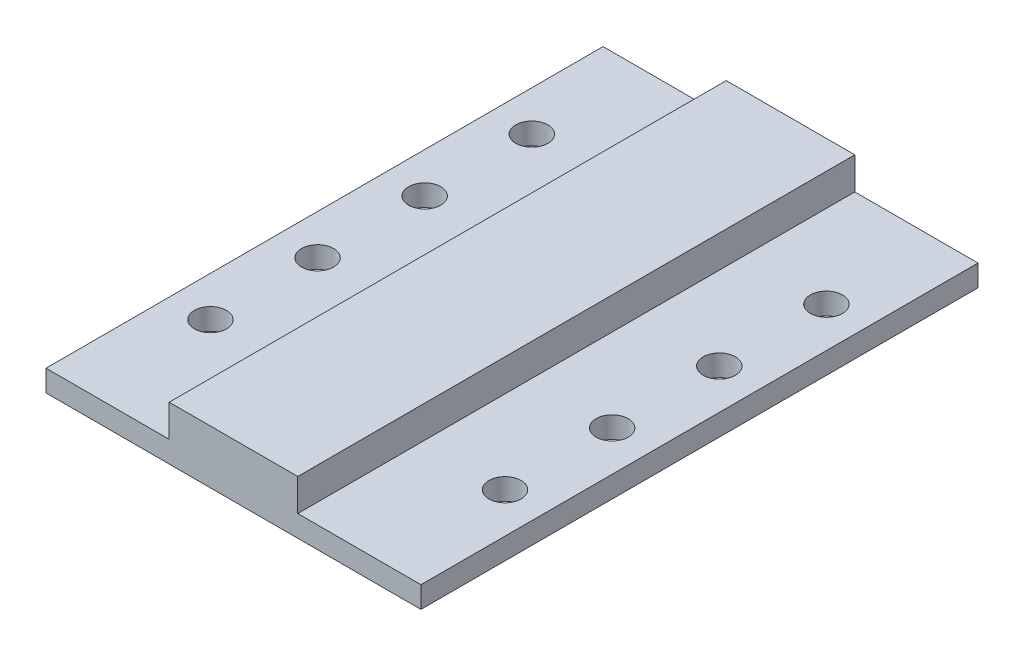
ISO-10303-21;
HEADER;
FILE_DESCRIPTION(('STEP AP214'),'2;1');
FILE_NAME('part.step','',(''),(''),'','','');
FILE_SCHEMA(('AUTOMOTIVE_DESIGN { 1 0 10303 214 1 1 1 1 }'));
ENDSEC;
DATA;
#1=APPLICATION_CONTEXT('core data for automotive mechanical design processes');
#2=APPLICATION_PROTOCOL_DEFINITION('international standard','automotive_design',2000,#1);
#3=PRODUCT_CONTEXT('',#1,'mechanical');
#4=PRODUCT('Part','Part','',(#3));
#5=PRODUCT_RELATED_PRODUCT_CATEGORY('part','',(#4));
#6=PRODUCT_DEFINITION_FORMATION('','',#4);
#7=PRODUCT_DEFINITION_CONTEXT('part definition',#1,'design');
#8=PRODUCT_DEFINITION('design','',#6,#7);
#9=PRODUCT_DEFINITION_SHAPE('','',#8);
#10=(LENGTH_UNIT() NAMED_UNIT(*) SI_UNIT(.MILLI.,.METRE.));
#11=(NAMED_UNIT(*) PLANE_ANGLE_UNIT() SI_UNIT($,.RADIAN.));
#12=(NAMED_UNIT(*) SI_UNIT($,.STERADIAN.) SOLID_ANGLE_UNIT());
#13=UNCERTAINTY_MEASURE_WITH_UNIT(LENGTH_MEASURE(1.E-05),#10,'distance_accuracy_value','');
#14=(GEOMETRIC_REPRESENTATION_CONTEXT(3) GLOBAL_UNCERTAINTY_ASSIGNED_CONTEXT((#13)) GLOBAL_UNIT_ASSIGNED_CONTEXT((#10,
#11,#12)) REPRESENTATION_CONTEXT('',''));
#15=CARTESIAN_POINT('',(0.,0.,0.));
#16=DIRECTION('',(0.,0.,1.));
#17=DIRECTION('',(1.,0.,0.));
#18=AXIS2_PLACEMENT_3D('',#15,#16,#17);
#19=CARTESIAN_POINT('',(0.,2.,0.));
#20=DIRECTION('',(0.,1.,0.));
#21=DIRECTION('',(0.,0.,1.));
#22=AXIS2_PLACEMENT_3D('',#19,#20,#21);
#23=PLANE('',#22);
#24=CARTESIAN_POINT('',(-13.7500000000002,2.,-5.60000000000058));
#25=DIRECTION('',(0.,1.,0.));
#26=DIRECTION('',(0.,0.,1.));
#27=AXIS2_PLACEMENT_3D('',#24,#25,#26);
#28=CIRCLE('',#27,1.50000000000006);
#29=CARTESIAN_POINT('',(-13.7500000000002,2.,-4.10000000000052));
#30=VERTEX_POINT('',#29);
#31=EDGE_CURVE('E433',#30,#30,#28,.T.);
#32=ORIENTED_EDGE('',*,*,#31,.F.);
#33=EDGE_LOOP('',(#32));
#34=FACE_BOUND('',#33,.T.);
#35=CARTESIAN_POINT('',(-13.7500000000003,2.,-15.6000000000006));
#36=DIRECTION('',(0.,1.,0.));
#37=DIRECTION('',(0.,0.,1.));
#38=AXIS2_PLACEMENT_3D('',#35,#36,#37);
#39=CIRCLE('',#38,1.50000000000006);
#40=CARTESIAN_POINT('',(-13.7500000000003,2.,-14.1000000000005));
#41=VERTEX_POINT('',#40);
#42=EDGE_CURVE('E231',#41,#41,#39,.T.);
#43=ORIENTED_EDGE('',*,*,#42,.F.);
#44=EDGE_LOOP('',(#43));
#45=FACE_BOUND('',#44,.T.);
#46=CARTESIAN_POINT('',(-13.75,2.,14.3999999999994));
#47=DIRECTION('',(0.,1.,0.));
#48=DIRECTION('',(0.,0.,1.));
#49=AXIS2_PLACEMENT_3D('',#46,#47,#48);
#50=CIRCLE('',#49,1.50000000000006);
#51=CARTESIAN_POINT('',(-13.75,2.,15.8999999999995));
#52=VERTEX_POINT('',#51);
#53=EDGE_CURVE('E440',#52,#52,#50,.T.);
#54=ORIENTED_EDGE('',*,*,#53,.F.);
#55=EDGE_LOOP('',(#54));
#56=FACE_BOUND('',#55,.T.);
#57=CARTESIAN_POINT('',(-13.7500000000001,2.,4.39999999999942));
#58=DIRECTION('',(0.,1.,0.));
#59=DIRECTION('',(0.,0.,1.));
#60=AXIS2_PLACEMENT_3D('',#57,#58,#59);
#61=CIRCLE('',#60,1.50000000000006);
#62=CARTESIAN_POINT('',(-13.7500000000001,2.,5.89999999999948));
#63=VERTEX_POINT('',#62);
#64=EDGE_CURVE('E436',#63,#63,#61,.T.);
#65=ORIENTED_EDGE('',*,*,#64,.F.);
#66=EDGE_LOOP('',(#65));
#67=FACE_BOUND('',#66,.T.);
#68=DIRECTION('',(1.,0.,0.));
#69=VECTOR('',#68,1.);
#70=CARTESIAN_POINT('',(17.5,2.,26.));
#71=LINE('',#70,#69);
#72=CARTESIAN_POINT('',(-17.5,2.,26.));
#73=VERTEX_POINT('',#72);
#74=CARTESIAN_POINT('',(-6.,2.,26.));
#75=VERTEX_POINT('',#74);
#76=EDGE_CURVE('E138',#73,#75,#71,.T.);
#77=ORIENTED_EDGE('',*,*,#76,.T.);
#78=DIRECTION('',(0.,0.,-1.));
#79=VECTOR('',#78,1.);
#80=CARTESIAN_POINT('',(-6.,2.,38.369316876853));
#81=LINE('',#80,#79);
#82=CARTESIAN_POINT('',(-6.,2.,-26.));
#83=VERTEX_POINT('',#82);
#84=EDGE_CURVE('E119',#75,#83,#81,.T.);
#85=ORIENTED_EDGE('',*,*,#84,.T.);
#86=DIRECTION('',(-1.,0.,0.));
#87=VECTOR('',#86,1.);
#88=CARTESIAN_POINT('',(17.5,2.,-26.));
#89=LINE('',#88,#87);
#90=CARTESIAN_POINT('',(-17.5,2.,-26.));
#91=VERTEX_POINT('',#90);
#92=EDGE_CURVE('E132',#83,#91,#89,.T.);
#93=ORIENTED_EDGE('',*,*,#92,.T.);
#94=DIRECTION('',(0.,0.,1.));
#95=VECTOR('',#94,1.);
#96=CARTESIAN_POINT('',(-17.5,2.,26.));
#97=LINE('',#96,#95);
#98=EDGE_CURVE('E131',#91,#73,#97,.T.);
#99=ORIENTED_EDGE('',*,*,#98,.T.);
#100=EDGE_LOOP('',(#77,#85,#93,#99));
#101=FACE_BOUND('',#100,.T.);
#102=ADVANCED_FACE('F36',(#34,#45,#56,#67,#101),#23,.T.);
#103=CARTESIAN_POINT('',(17.5,2.,26.));
#104=DIRECTION('',(-1.,0.,0.));
#105=DIRECTION('',(0.,0.,1.));
#106=AXIS2_PLACEMENT_3D('',#103,#104,#105);
#107=PLANE('',#106);
#108=DIRECTION('',(0.,0.,-1.));
#109=VECTOR('',#108,1.);
#110=CARTESIAN_POINT('',(17.5,0.,26.));
#111=LINE('',#110,#109);
#112=CARTESIAN_POINT('',(17.5,0.,26.));
#113=VERTEX_POINT('',#112);
#114=CARTESIAN_POINT('',(17.5,0.,-26.));
#115=VERTEX_POINT('',#114);
#116=EDGE_CURVE('E142',#113,#115,#111,.T.);
#117=ORIENTED_EDGE('',*,*,#116,.T.);
#118=DIRECTION('',(0.,-1.,0.));
#119=VECTOR('',#118,1.);
#120=CARTESIAN_POINT('',(17.5,2.,-26.));
#121=LINE('',#120,#119);
#122=CARTESIAN_POINT('',(17.5,2.,-26.));
#123=VERTEX_POINT('',#122);
#124=EDGE_CURVE('E11',#123,#115,#121,.T.);
#125=ORIENTED_EDGE('',*,*,#124,.F.);
#126=DIRECTION('',(0.,0.,-1.));
#127=VECTOR('',#126,1.);
#128=CARTESIAN_POINT('',(17.5,2.,26.));
#129=LINE('',#128,#127);
#130=CARTESIAN_POINT('',(17.5,2.,26.));
#131=VERTEX_POINT('',#130);
#132=EDGE_CURVE('E129',#131,#123,#129,.T.);
#133=ORIENTED_EDGE('',*,*,#132,.F.);
#134=DIRECTION('',(0.,-1.,0.));
#135=VECTOR('',#134,1.);
#136=CARTESIAN_POINT('',(17.5,2.,26.));
#137=LINE('',#136,#135);
#138=EDGE_CURVE('E141',#131,#113,#137,.T.);
#139=ORIENTED_EDGE('',*,*,#138,.T.);
#140=EDGE_LOOP('',(#117,#125,#133,#139));
#141=FACE_BOUND('',#140,.T.);
#142=ADVANCED_FACE('F38',(#141),#107,.F.);
#143=CARTESIAN_POINT('',(17.5,2.,-26.));
#144=DIRECTION('',(0.,0.,1.));
#145=DIRECTION('',(1.,0.,0.));
#146=AXIS2_PLACEMENT_3D('',#143,#144,#145);
#147=PLANE('',#146);
#148=DIRECTION('',(-1.,0.,0.));
#149=VECTOR('',#148,1.);
#150=CARTESIAN_POINT('',(17.5,0.,-26.));
#151=LINE('',#150,#149);
#152=CARTESIAN_POINT('',(-17.5,0.,-26.));
#153=VERTEX_POINT('',#152);
#154=EDGE_CURVE('E145',#115,#153,#151,.T.);
#155=ORIENTED_EDGE('',*,*,#154,.T.);
#156=DIRECTION('',(0.,-1.,0.));
#157=VECTOR('',#156,1.);
#158=CARTESIAN_POINT('',(-17.5,2.,-26.));
#159=LINE('',#158,#157);
#160=EDGE_CURVE('E45',#91,#153,#159,.T.);
#161=ORIENTED_EDGE('',*,*,#160,.F.);
#162=ORIENTED_EDGE('',*,*,#92,.F.);
#163=DIRECTION('',(0.,1.,0.));
#164=VECTOR('',#163,1.);
#165=CARTESIAN_POINT('',(-6.,2.,-26.));
#166=LINE('',#165,#164);
#167=CARTESIAN_POINT('',(-6.,5.,-26.));
#168=VERTEX_POINT('',#167);
#169=EDGE_CURVE('E53',#83,#168,#166,.T.);
#170=ORIENTED_EDGE('',*,*,#169,.T.);
#171=DIRECTION('',(1.,0.,0.));
#172=VECTOR('',#171,1.);
#173=CARTESIAN_POINT('',(-6.,5.,-26.));
#174=LINE('',#173,#172);
#175=CARTESIAN_POINT('',(6.,5.,-26.));
#176=VERTEX_POINT('',#175);
#177=EDGE_CURVE('E125',#168,#176,#174,.T.);
#178=ORIENTED_EDGE('',*,*,#177,.T.);
#179=DIRECTION('',(0.,-1.,0.));
#180=VECTOR('',#179,1.);
#181=CARTESIAN_POINT('',(6.,2.,-26.));
#182=LINE('',#181,#180);
#183=CARTESIAN_POINT('',(6.,2.,-26.));
#184=VERTEX_POINT('',#183);
#185=EDGE_CURVE('E117',#176,#184,#182,.T.);
#186=ORIENTED_EDGE('',*,*,#185,.T.);
#187=EDGE_CURVE('E91',#123,#184,#89,.T.);
#188=ORIENTED_EDGE('',*,*,#187,.F.);
#189=ORIENTED_EDGE('',*,*,#124,.T.);
#190=EDGE_LOOP('',(#155,#161,#162,#170,#178,#186,#188,#189));
#191=FACE_BOUND('',#190,.T.);
#192=ADVANCED_FACE('F123',(#191),#147,.F.);
#193=CARTESIAN_POINT('',(-17.5,2.,26.));
#194=DIRECTION('',(1.,0.,0.));
#195=DIRECTION('',(0.,0.,-1.));
#196=AXIS2_PLACEMENT_3D('',#193,#194,#195);
#197=PLANE('',#196);
#198=DIRECTION('',(0.,0.,1.));
#199=VECTOR('',#198,1.);
#200=CARTESIAN_POINT('',(-17.5,0.,26.));
#201=LINE('',#200,#199);
#202=CARTESIAN_POINT('',(-17.5,0.,26.));
#203=VERTEX_POINT('',#202);
#204=EDGE_CURVE('E148',#153,#203,#201,.T.);
#205=ORIENTED_EDGE('',*,*,#204,.T.);
#206=DIRECTION('',(0.,-1.,0.));
#207=VECTOR('',#206,1.);
#208=CARTESIAN_POINT('',(-17.5,2.,26.));
#209=LINE('',#208,#207);
#210=EDGE_CURVE('E152',#73,#203,#209,.T.);
#211=ORIENTED_EDGE('',*,*,#210,.F.);
#212=ORIENTED_EDGE('',*,*,#98,.F.);
#213=ORIENTED_EDGE('',*,*,#160,.T.);
#214=EDGE_LOOP('',(#205,#211,#212,#213));
#215=FACE_BOUND('',#214,.T.);
#216=ADVANCED_FACE('F215',(#215),#197,.F.);
#217=CARTESIAN_POINT('',(17.5,2.,26.));
#218=DIRECTION('',(0.,0.,-1.));
#219=DIRECTION('',(-1.,0.,0.));
#220=AXIS2_PLACEMENT_3D('',#217,#218,#219);
#221=PLANE('',#220);
#222=DIRECTION('',(1.,0.,0.));
#223=VECTOR('',#222,1.);
#224=CARTESIAN_POINT('',(17.5,0.,26.));
#225=LINE('',#224,#223);
#226=EDGE_CURVE('E84',#203,#113,#225,.T.);
#227=ORIENTED_EDGE('',*,*,#226,.T.);
#228=ORIENTED_EDGE('',*,*,#138,.F.);
#229=CARTESIAN_POINT('',(6.,2.,26.));
#230=VERTEX_POINT('',#229);
#231=EDGE_CURVE('E62',#230,#131,#71,.T.);
#232=ORIENTED_EDGE('',*,*,#231,.F.);
#233=DIRECTION('',(0.,-1.,0.));
#234=VECTOR('',#233,1.);
#235=CARTESIAN_POINT('',(6.,2.,26.));
#236=LINE('',#235,#234);
#237=CARTESIAN_POINT('',(6.,5.,26.));
#238=VERTEX_POINT('',#237);
#239=EDGE_CURVE('E118',#238,#230,#236,.T.);
#240=ORIENTED_EDGE('',*,*,#239,.F.);
#241=DIRECTION('',(1.,0.,0.));
#242=VECTOR('',#241,1.);
#243=CARTESIAN_POINT('',(-6.,5.,26.));
#244=LINE('',#243,#242);
#245=CARTESIAN_POINT('',(-6.,5.,26.));
#246=VERTEX_POINT('',#245);
#247=EDGE_CURVE('E241',#246,#238,#244,.T.);
#248=ORIENTED_EDGE('',*,*,#247,.F.);
#249=DIRECTION('',(0.,1.,0.));
#250=VECTOR('',#249,1.);
#251=CARTESIAN_POINT('',(-6.,2.,26.));
#252=LINE('',#251,#250);
#253=EDGE_CURVE('E146',#75,#246,#252,.T.);
#254=ORIENTED_EDGE('',*,*,#253,.F.);
#255=ORIENTED_EDGE('',*,*,#76,.F.);
#256=ORIENTED_EDGE('',*,*,#210,.T.);
#257=EDGE_LOOP('',(#227,#228,#232,#240,#248,#254,#255,#256));
#258=FACE_BOUND('',#257,.T.);
#259=ADVANCED_FACE('F208',(#258),#221,.F.);
#260=CARTESIAN_POINT('',(13.7499999999999,2.,4.39999999999942));
#261=DIRECTION('',(0.,1.,0.));
#262=DIRECTION('',(0.,0.,1.));
#263=AXIS2_PLACEMENT_3D('',#260,#261,#262);
#264=CIRCLE('',#263,1.49999999999994);
#265=CARTESIAN_POINT('',(13.7499999999999,2.,5.89999999999937));
#266=VERTEX_POINT('',#265);
#267=EDGE_CURVE('E219',#266,#266,#264,.T.);
#268=ORIENTED_EDGE('',*,*,#267,.F.);
#269=EDGE_LOOP('',(#268));
#270=FACE_BOUND('',#269,.T.);
#271=CARTESIAN_POINT('',(13.7499999999998,2.,-5.60000000000058));
#272=DIRECTION('',(0.,1.,0.));
#273=DIRECTION('',(0.,0.,1.));
#274=AXIS2_PLACEMENT_3D('',#271,#272,#273);
#275=CIRCLE('',#274,1.49999999999994);
#276=CARTESIAN_POINT('',(13.7499999999998,2.,-4.10000000000063));
#277=VERTEX_POINT('',#276);
#278=EDGE_CURVE('E223',#277,#277,#275,.T.);
#279=ORIENTED_EDGE('',*,*,#278,.F.);
#280=EDGE_LOOP('',(#279));
#281=FACE_BOUND('',#280,.T.);
#282=CARTESIAN_POINT('',(13.75,2.,14.3999999999994));
#283=DIRECTION('',(0.,1.,0.));
#284=DIRECTION('',(0.,0.,1.));
#285=AXIS2_PLACEMENT_3D('',#282,#283,#284);
#286=CIRCLE('',#285,1.49999999999994);
#287=CARTESIAN_POINT('',(13.75,2.,15.8999999999994));
#288=VERTEX_POINT('',#287);
#289=EDGE_CURVE('E227',#288,#288,#286,.T.);
#290=ORIENTED_EDGE('',*,*,#289,.F.);
#291=EDGE_LOOP('',(#290));
#292=FACE_BOUND('',#291,.T.);
#293=CARTESIAN_POINT('',(13.7499999999997,2.,-15.6000000000006));
#294=DIRECTION('',(0.,1.,0.));
#295=DIRECTION('',(0.,0.,1.));
#296=AXIS2_PLACEMENT_3D('',#293,#294,#295);
#297=CIRCLE('',#296,1.49999999999994);
#298=CARTESIAN_POINT('',(13.7499999999997,2.,-14.1000000000006));
#299=VERTEX_POINT('',#298);
#300=EDGE_CURVE('E160',#299,#299,#297,.T.);
#301=ORIENTED_EDGE('',*,*,#300,.F.);
#302=EDGE_LOOP('',(#301));
#303=FACE_BOUND('',#302,.T.);
#304=DIRECTION('',(0.,0.,-1.));
#305=VECTOR('',#304,1.);
#306=CARTESIAN_POINT('',(6.,2.,38.369316876853));
#307=LINE('',#306,#305);
#308=EDGE_CURVE('E114',#230,#184,#307,.T.);
#309=ORIENTED_EDGE('',*,*,#308,.F.);
#310=ORIENTED_EDGE('',*,*,#231,.T.);
#311=ORIENTED_EDGE('',*,*,#132,.T.);
#312=ORIENTED_EDGE('',*,*,#187,.T.);
#313=EDGE_LOOP('',(#309,#310,#311,#312));
#314=FACE_BOUND('',#313,.T.);
#315=ADVANCED_FACE('F127',(#270,#281,#292,#303,#314),#23,.T.);
#316=CARTESIAN_POINT('',(0.,0.,0.));
#317=DIRECTION('',(0.,1.,0.));
#318=DIRECTION('',(0.,0.,1.));
#319=AXIS2_PLACEMENT_3D('',#316,#317,#318);
#320=PLANE('',#319);
#321=CARTESIAN_POINT('',(13.7499999999999,0.,4.39999999999942));
#322=DIRECTION('',(0.,1.,0.));
#323=DIRECTION('',(0.,0.,1.));
#324=AXIS2_PLACEMENT_3D('',#321,#322,#323);
#325=CIRCLE('',#324,1.49999999999994);
#326=CARTESIAN_POINT('',(13.7499999999999,0.,5.89999999999937));
#327=VERTEX_POINT('',#326);
#328=EDGE_CURVE('E40',#327,#327,#325,.T.);
#329=ORIENTED_EDGE('',*,*,#328,.T.);
#330=EDGE_LOOP('',(#329));
#331=FACE_BOUND('',#330,.T.);
#332=CARTESIAN_POINT('',(-13.7500000000002,0.,-5.60000000000058));
#333=DIRECTION('',(0.,1.,0.));
#334=DIRECTION('',(0.,0.,1.));
#335=AXIS2_PLACEMENT_3D('',#332,#333,#334);
#336=CIRCLE('',#335,1.50000000000006);
#337=CARTESIAN_POINT('',(-13.7500000000002,0.,-4.10000000000052));
#338=VERTEX_POINT('',#337);
#339=EDGE_CURVE('E174',#338,#338,#336,.T.);
#340=ORIENTED_EDGE('',*,*,#339,.T.);
#341=EDGE_LOOP('',(#340));
#342=FACE_BOUND('',#341,.T.);
#343=CARTESIAN_POINT('',(13.7499999999998,0.,-5.60000000000058));
#344=DIRECTION('',(0.,1.,0.));
#345=DIRECTION('',(0.,0.,1.));
#346=AXIS2_PLACEMENT_3D('',#343,#344,#345);
#347=CIRCLE('',#346,1.49999999999994);
#348=CARTESIAN_POINT('',(13.7499999999998,0.,-4.10000000000063));
#349=VERTEX_POINT('',#348);
#350=EDGE_CURVE('E172',#349,#349,#347,.T.);
#351=ORIENTED_EDGE('',*,*,#350,.T.);
#352=EDGE_LOOP('',(#351));
#353=FACE_BOUND('',#352,.T.);
#354=CARTESIAN_POINT('',(-13.7500000000003,0.,-15.6000000000006));
#355=DIRECTION('',(0.,1.,0.));
#356=DIRECTION('',(0.,0.,1.));
#357=AXIS2_PLACEMENT_3D('',#354,#355,#356);
#358=CIRCLE('',#357,1.50000000000006);
#359=CARTESIAN_POINT('',(-13.7500000000003,0.,-14.1000000000005));
#360=VERTEX_POINT('',#359);
#361=EDGE_CURVE('E169',#360,#360,#358,.T.);
#362=ORIENTED_EDGE('',*,*,#361,.T.);
#363=EDGE_LOOP('',(#362));
#364=FACE_BOUND('',#363,.T.);
#365=CARTESIAN_POINT('',(-13.75,0.,14.3999999999994));
#366=DIRECTION('',(0.,1.,0.));
#367=DIRECTION('',(0.,0.,1.));
#368=AXIS2_PLACEMENT_3D('',#365,#366,#367);
#369=CIRCLE('',#368,1.50000000000006);
#370=CARTESIAN_POINT('',(-13.75,0.,15.8999999999995));
#371=VERTEX_POINT('',#370);
#372=EDGE_CURVE('E166',#371,#371,#369,.T.);
#373=ORIENTED_EDGE('',*,*,#372,.T.);
#374=EDGE_LOOP('',(#373));
#375=FACE_BOUND('',#374,.T.);
#376=CARTESIAN_POINT('',(13.75,0.,14.3999999999994));
#377=DIRECTION('',(0.,1.,0.));
#378=DIRECTION('',(0.,0.,1.));
#379=AXIS2_PLACEMENT_3D('',#376,#377,#378);
#380=CIRCLE('',#379,1.49999999999994);
#381=CARTESIAN_POINT('',(13.75,0.,15.8999999999994));
#382=VERTEX_POINT('',#381);
#383=EDGE_CURVE('E163',#382,#382,#380,.T.);
#384=ORIENTED_EDGE('',*,*,#383,.T.);
#385=EDGE_LOOP('',(#384));
#386=FACE_BOUND('',#385,.T.);
#387=CARTESIAN_POINT('',(-13.7500000000001,0.,4.39999999999942));
#388=DIRECTION('',(0.,1.,0.));
#389=DIRECTION('',(0.,0.,1.));
#390=AXIS2_PLACEMENT_3D('',#387,#388,#389);
#391=CIRCLE('',#390,1.50000000000006);
#392=CARTESIAN_POINT('',(-13.7500000000001,0.,5.89999999999948));
#393=VERTEX_POINT('',#392);
#394=EDGE_CURVE('E159',#393,#393,#391,.T.);
#395=ORIENTED_EDGE('',*,*,#394,.T.);
#396=EDGE_LOOP('',(#395));
#397=FACE_BOUND('',#396,.T.);
#398=CARTESIAN_POINT('',(13.7499999999997,0.,-15.6000000000006));
#399=DIRECTION('',(0.,1.,0.));
#400=DIRECTION('',(0.,0.,1.));
#401=AXIS2_PLACEMENT_3D('',#398,#399,#400);
#402=CIRCLE('',#401,1.49999999999994);
#403=CARTESIAN_POINT('',(13.7499999999997,0.,-14.1000000000006));
#404=VERTEX_POINT('',#403);
#405=EDGE_CURVE('E156',#404,#404,#402,.T.);
#406=ORIENTED_EDGE('',*,*,#405,.T.);
#407=EDGE_LOOP('',(#406));
#408=FACE_BOUND('',#407,.T.);
#409=ORIENTED_EDGE('',*,*,#116,.F.);
#410=ORIENTED_EDGE('',*,*,#226,.F.);
#411=ORIENTED_EDGE('',*,*,#204,.F.);
#412=ORIENTED_EDGE('',*,*,#154,.F.);
#413=EDGE_LOOP('',(#409,#410,#411,#412));
#414=FACE_BOUND('',#413,.T.);
#415=ADVANCED_FACE('F181',(#331,#342,#353,#364,#375,#386,#397,#408,#414),#320,.F.);
#416=CARTESIAN_POINT('',(-6.,5.,38.369316876853));
#417=DIRECTION('',(0.,-1.,0.));
#418=DIRECTION('',(1.,0.,0.));
#419=AXIS2_PLACEMENT_3D('',#416,#417,#418);
#420=PLANE('',#419);
#421=DIRECTION('',(0.,0.,-1.));
#422=VECTOR('',#421,1.);
#423=CARTESIAN_POINT('',(-6.,5.,38.369316876853));
#424=LINE('',#423,#422);
#425=EDGE_CURVE('E239',#246,#168,#424,.T.);
#426=ORIENTED_EDGE('',*,*,#425,.F.);
#427=ORIENTED_EDGE('',*,*,#247,.T.);
#428=DIRECTION('',(0.,0.,-1.));
#429=VECTOR('',#428,1.);
#430=CARTESIAN_POINT('',(6.,5.,38.369316876853));
#431=LINE('',#430,#429);
#432=EDGE_CURVE('E120',#238,#176,#431,.T.);
#433=ORIENTED_EDGE('',*,*,#432,.T.);
#434=ORIENTED_EDGE('',*,*,#177,.F.);
#435=EDGE_LOOP('',(#426,#427,#433,#434));
#436=FACE_BOUND('',#435,.T.);
#437=ADVANCED_FACE('F214',(#436),#420,.F.);
#438=CARTESIAN_POINT('',(6.,2.,38.369316876853));
#439=DIRECTION('',(-1.,0.,0.));
#440=DIRECTION('',(0.,0.,1.));
#441=AXIS2_PLACEMENT_3D('',#438,#439,#440);
#442=PLANE('',#441);
#443=ORIENTED_EDGE('',*,*,#432,.F.);
#444=ORIENTED_EDGE('',*,*,#239,.T.);
#445=ORIENTED_EDGE('',*,*,#308,.T.);
#446=ORIENTED_EDGE('',*,*,#185,.F.);
#447=EDGE_LOOP('',(#443,#444,#445,#446));
#448=FACE_BOUND('',#447,.T.);
#449=ADVANCED_FACE('F116',(#448),#442,.F.);
#450=CARTESIAN_POINT('',(-6.,2.,38.369316876853));
#451=DIRECTION('',(1.,0.,0.));
#452=DIRECTION('',(0.,0.,-1.));
#453=AXIS2_PLACEMENT_3D('',#450,#451,#452);
#454=PLANE('',#453);
#455=ORIENTED_EDGE('',*,*,#84,.F.);
#456=ORIENTED_EDGE('',*,*,#253,.T.);
#457=ORIENTED_EDGE('',*,*,#425,.T.);
#458=ORIENTED_EDGE('',*,*,#169,.F.);
#459=EDGE_LOOP('',(#455,#456,#457,#458));
#460=FACE_BOUND('',#459,.T.);
#461=ADVANCED_FACE('F250',(#460),#454,.F.);
#462=CARTESIAN_POINT('',(13.7499999999997,-8.,-15.6000000000006));
#463=DIRECTION('',(0.,1.,0.));
#464=DIRECTION('',(0.,0.,1.));
#465=AXIS2_PLACEMENT_3D('',#462,#463,#464);
#466=CYLINDRICAL_SURFACE('',#465,1.49999999999994);
#467=ORIENTED_EDGE('',*,*,#300,.T.);
#468=EDGE_LOOP('',(#467));
#469=FACE_BOUND('',#468,.T.);
#470=ORIENTED_EDGE('',*,*,#405,.F.);
#471=EDGE_LOOP('',(#470));
#472=FACE_BOUND('',#471,.T.);
#473=ADVANCED_FACE('F300',(#469,#472),#466,.F.);
#474=CARTESIAN_POINT('',(-13.7500000000001,-8.,4.39999999999942));
#475=DIRECTION('',(0.,1.,0.));
#476=DIRECTION('',(0.,0.,1.));
#477=AXIS2_PLACEMENT_3D('',#474,#475,#476);
#478=CYLINDRICAL_SURFACE('',#477,1.50000000000006);
#479=ORIENTED_EDGE('',*,*,#64,.T.);
#480=EDGE_LOOP('',(#479));
#481=FACE_BOUND('',#480,.T.);
#482=ORIENTED_EDGE('',*,*,#394,.F.);
#483=EDGE_LOOP('',(#482));
#484=FACE_BOUND('',#483,.T.);
#485=ADVANCED_FACE('F306',(#481,#484),#478,.F.);
#486=CARTESIAN_POINT('',(13.75,-8.,14.3999999999994));
#487=DIRECTION('',(0.,1.,0.));
#488=DIRECTION('',(0.,0.,1.));
#489=AXIS2_PLACEMENT_3D('',#486,#487,#488);
#490=CYLINDRICAL_SURFACE('',#489,1.49999999999994);
#491=ORIENTED_EDGE('',*,*,#289,.T.);
#492=EDGE_LOOP('',(#491));
#493=FACE_BOUND('',#492,.T.);
#494=ORIENTED_EDGE('',*,*,#383,.F.);
#495=EDGE_LOOP('',(#494));
#496=FACE_BOUND('',#495,.T.);
#497=ADVANCED_FACE('F315',(#493,#496),#490,.F.);
#498=CARTESIAN_POINT('',(-13.75,-8.,14.3999999999994));
#499=DIRECTION('',(0.,1.,0.));
#500=DIRECTION('',(0.,0.,1.));
#501=AXIS2_PLACEMENT_3D('',#498,#499,#500);
#502=CYLINDRICAL_SURFACE('',#501,1.50000000000006);
#503=ORIENTED_EDGE('',*,*,#53,.T.);
#504=EDGE_LOOP('',(#503));
#505=FACE_BOUND('',#504,.T.);
#506=ORIENTED_EDGE('',*,*,#372,.F.);
#507=EDGE_LOOP('',(#506));
#508=FACE_BOUND('',#507,.T.);
#509=ADVANCED_FACE('F325',(#505,#508),#502,.F.);
#510=CARTESIAN_POINT('',(-13.7500000000003,-8.,-15.6000000000006));
#511=DIRECTION('',(0.,1.,0.));
#512=DIRECTION('',(0.,0.,1.));
#513=AXIS2_PLACEMENT_3D('',#510,#511,#512);
#514=CYLINDRICAL_SURFACE('',#513,1.50000000000006);
#515=ORIENTED_EDGE('',*,*,#42,.T.);
#516=EDGE_LOOP('',(#515));
#517=FACE_BOUND('',#516,.T.);
#518=ORIENTED_EDGE('',*,*,#361,.F.);
#519=EDGE_LOOP('',(#518));
#520=FACE_BOUND('',#519,.T.);
#521=ADVANCED_FACE('F335',(#517,#520),#514,.F.);
#522=CARTESIAN_POINT('',(13.7499999999998,-8.,-5.60000000000058));
#523=DIRECTION('',(0.,1.,0.));
#524=DIRECTION('',(0.,0.,1.));
#525=AXIS2_PLACEMENT_3D('',#522,#523,#524);
#526=CYLINDRICAL_SURFACE('',#525,1.49999999999994);
#527=ORIENTED_EDGE('',*,*,#278,.T.);
#528=EDGE_LOOP('',(#527));
#529=FACE_BOUND('',#528,.T.);
#530=ORIENTED_EDGE('',*,*,#350,.F.);
#531=EDGE_LOOP('',(#530));
#532=FACE_BOUND('',#531,.T.);
#533=ADVANCED_FACE('F191',(#529,#532),#526,.F.);
#534=CARTESIAN_POINT('',(-13.7500000000002,-8.,-5.60000000000058));
#535=DIRECTION('',(0.,1.,0.));
#536=DIRECTION('',(0.,0.,1.));
#537=AXIS2_PLACEMENT_3D('',#534,#535,#536);
#538=CYLINDRICAL_SURFACE('',#537,1.50000000000006);
#539=ORIENTED_EDGE('',*,*,#31,.T.);
#540=EDGE_LOOP('',(#539));
#541=FACE_BOUND('',#540,.T.);
#542=ORIENTED_EDGE('',*,*,#339,.F.);
#543=EDGE_LOOP('',(#542));
#544=FACE_BOUND('',#543,.T.);
#545=ADVANCED_FACE('F185',(#541,#544),#538,.F.);
#546=CARTESIAN_POINT('',(13.7499999999999,-8.,4.39999999999942));
#547=DIRECTION('',(0.,1.,0.));
#548=DIRECTION('',(0.,0.,1.));
#549=AXIS2_PLACEMENT_3D('',#546,#547,#548);
#550=CYLINDRICAL_SURFACE('',#549,1.49999999999994);
#551=ORIENTED_EDGE('',*,*,#267,.T.);
#552=EDGE_LOOP('',(#551));
#553=FACE_BOUND('',#552,.T.);
#554=ORIENTED_EDGE('',*,*,#328,.F.);
#555=EDGE_LOOP('',(#554));
#556=FACE_BOUND('',#555,.T.);
#557=ADVANCED_FACE('F183',(#553,#556),#550,.F.);
#558=CLOSED_SHELL('',(#102,#142,#192,#216,#259,#315,#415,#437,#449,#461,#473,#485,#497,#509,
#521,#533,#545,#557));
#559=MANIFOLD_SOLID_BREP('B2',#558);
#560=ADVANCED_BREP_SHAPE_REPRESENTATION('',(#18,#559),#14);
#561=SHAPE_DEFINITION_REPRESENTATION(#9,#560);
ENDSEC;
END-ISO-10303-21;
